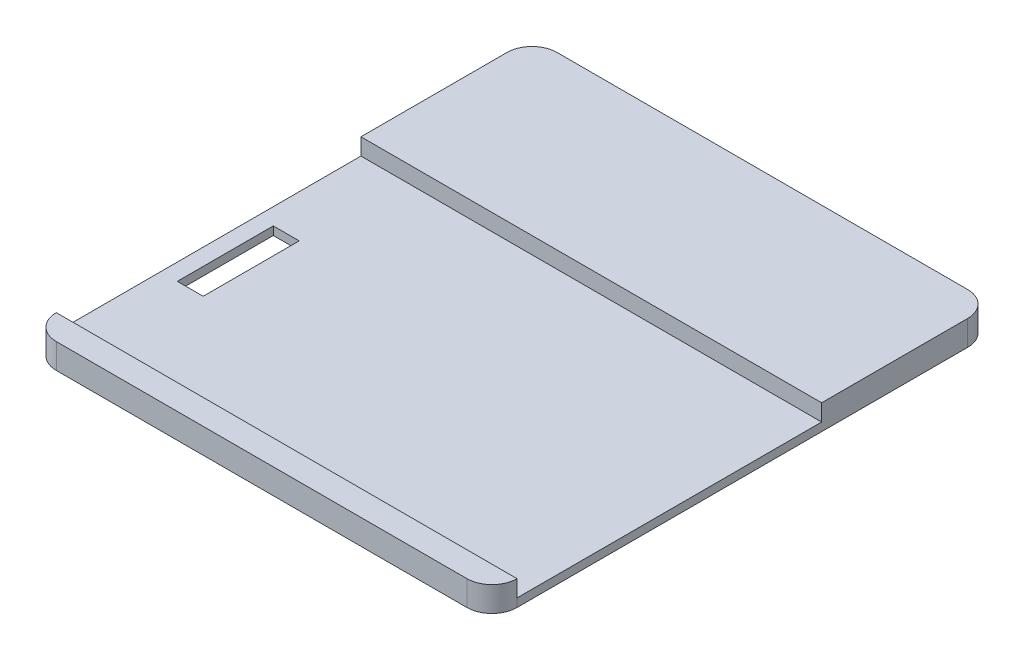
ISO-10303-21;
HEADER;
FILE_DESCRIPTION(('STEP AP214'),'2;1');
FILE_NAME('part.step','',(''),(''),'','','');
FILE_SCHEMA(('AUTOMOTIVE_DESIGN { 1 0 10303 214 1 1 1 1 }'));
ENDSEC;
DATA;
#1=APPLICATION_CONTEXT('core data for automotive mechanical design processes');
#2=APPLICATION_PROTOCOL_DEFINITION('international standard','automotive_design',2000,#1);
#3=PRODUCT_CONTEXT('',#1,'mechanical');
#4=PRODUCT('Part','Part','',(#3));
#5=PRODUCT_RELATED_PRODUCT_CATEGORY('part','',(#4));
#6=PRODUCT_DEFINITION_FORMATION('','',#4);
#7=PRODUCT_DEFINITION_CONTEXT('part definition',#1,'design');
#8=PRODUCT_DEFINITION('design','',#6,#7);
#9=PRODUCT_DEFINITION_SHAPE('','',#8);
#10=(LENGTH_UNIT() NAMED_UNIT(*) SI_UNIT(.MILLI.,.METRE.));
#11=(NAMED_UNIT(*) PLANE_ANGLE_UNIT() SI_UNIT($,.RADIAN.));
#12=(NAMED_UNIT(*) SI_UNIT($,.STERADIAN.) SOLID_ANGLE_UNIT());
#13=UNCERTAINTY_MEASURE_WITH_UNIT(LENGTH_MEASURE(1.E-05),#10,'distance_accuracy_value','');
#14=(GEOMETRIC_REPRESENTATION_CONTEXT(3) GLOBAL_UNCERTAINTY_ASSIGNED_CONTEXT((#13)) GLOBAL_UNIT_ASSIGNED_CONTEXT((#10,
#11,#12)) REPRESENTATION_CONTEXT('',''));
#15=CARTESIAN_POINT('',(0.,0.,0.));
#16=DIRECTION('',(0.,0.,1.));
#17=DIRECTION('',(1.,0.,0.));
#18=AXIS2_PLACEMENT_3D('',#15,#16,#17);
#19=CARTESIAN_POINT('',(-24.6,3.,27.));
#20=DIRECTION('',(0.,-1.,0.));
#21=DIRECTION('',(0.,0.,-1.));
#22=AXIS2_PLACEMENT_3D('',#19,#20,#21);
#23=CYLINDRICAL_SURFACE('',#22,3.);
#24=CARTESIAN_POINT('',(-24.6,0.,27.));
#25=DIRECTION('',(0.,1.,0.));
#26=DIRECTION('',(0.,0.,1.));
#27=AXIS2_PLACEMENT_3D('',#24,#25,#26);
#28=CIRCLE('',#27,3.);
#29=CARTESIAN_POINT('',(-24.6,0.,30.));
#30=VERTEX_POINT('',#29);
#31=CARTESIAN_POINT('',(-27.6,0.,27.));
#32=VERTEX_POINT('',#31);
#33=EDGE_CURVE('E236',#30,#32,#28,.F.);
#34=ORIENTED_EDGE('',*,*,#33,.F.);
#35=DIRECTION('',(0.,-1.,0.));
#36=VECTOR('',#35,1.);
#37=CARTESIAN_POINT('',(-24.6,3.,30.));
#38=LINE('',#37,#36);
#39=CARTESIAN_POINT('',(-24.6,3.,30.));
#40=VERTEX_POINT('',#39);
#41=EDGE_CURVE('E11',#40,#30,#38,.T.);
#42=ORIENTED_EDGE('',*,*,#41,.F.);
#43=CARTESIAN_POINT('',(-24.6,3.,27.));
#44=DIRECTION('',(0.,1.,0.));
#45=DIRECTION('',(0.,0.,1.));
#46=AXIS2_PLACEMENT_3D('',#43,#44,#45);
#47=CIRCLE('',#46,3.);
#48=CARTESIAN_POINT('',(-27.6,3.,27.));
#49=VERTEX_POINT('',#48);
#50=EDGE_CURVE('E244',#40,#49,#47,.F.);
#51=ORIENTED_EDGE('',*,*,#50,.T.);
#52=DIRECTION('',(0.,-1.,0.));
#53=VECTOR('',#52,1.);
#54=CARTESIAN_POINT('',(-27.6,3.,27.));
#55=LINE('',#54,#53);
#56=CARTESIAN_POINT('',(-27.6,1.,27.));
#57=VERTEX_POINT('',#56);
#58=EDGE_CURVE('E54',#49,#57,#55,.T.);
#59=ORIENTED_EDGE('',*,*,#58,.T.);
#60=DIRECTION('',(0.,-1.,0.));
#61=VECTOR('',#60,1.);
#62=CARTESIAN_POINT('',(-27.6,1.,27.));
#63=LINE('',#62,#61);
#64=EDGE_CURVE('E75',#57,#32,#63,.T.);
#65=ORIENTED_EDGE('',*,*,#64,.T.);
#66=EDGE_LOOP('',(#34,#42,#51,#59,#65));
#67=FACE_BOUND('',#66,.T.);
#68=ADVANCED_FACE('F35',(#67),#23,.T.);
#69=CARTESIAN_POINT('',(0.,3.,30.));
#70=DIRECTION('',(0.,0.,-1.));
#71=DIRECTION('',(-1.,0.,0.));
#72=AXIS2_PLACEMENT_3D('',#69,#70,#71);
#73=PLANE('',#72);
#74=DIRECTION('',(1.,0.,0.));
#75=VECTOR('',#74,1.);
#76=CARTESIAN_POINT('',(0.,0.,30.));
#77=LINE('',#76,#75);
#78=CARTESIAN_POINT('',(24.6,0.,30.));
#79=VERTEX_POINT('',#78);
#80=EDGE_CURVE('E255',#30,#79,#77,.T.);
#81=ORIENTED_EDGE('',*,*,#80,.T.);
#82=DIRECTION('',(0.,-1.,0.));
#83=VECTOR('',#82,1.);
#84=CARTESIAN_POINT('',(24.6,3.,30.));
#85=LINE('',#84,#83);
#86=CARTESIAN_POINT('',(24.6,3.,30.));
#87=VERTEX_POINT('',#86);
#88=EDGE_CURVE('E42',#87,#79,#85,.T.);
#89=ORIENTED_EDGE('',*,*,#88,.F.);
#90=DIRECTION('',(1.,0.,0.));
#91=VECTOR('',#90,1.);
#92=CARTESIAN_POINT('',(0.,3.,30.));
#93=LINE('',#92,#91);
#94=EDGE_CURVE('E246',#40,#87,#93,.T.);
#95=ORIENTED_EDGE('',*,*,#94,.F.);
#96=ORIENTED_EDGE('',*,*,#41,.T.);
#97=EDGE_LOOP('',(#81,#89,#95,#96));
#98=FACE_BOUND('',#97,.T.);
#99=ADVANCED_FACE('F270',(#98),#73,.F.);
#100=CARTESIAN_POINT('',(24.6,3.,27.));
#101=DIRECTION('',(0.,-1.,0.));
#102=DIRECTION('',(0.,0.,-1.));
#103=AXIS2_PLACEMENT_3D('',#100,#101,#102);
#104=CYLINDRICAL_SURFACE('',#103,3.);
#105=CARTESIAN_POINT('',(24.6,0.,27.));
#106=DIRECTION('',(0.,1.,0.));
#107=DIRECTION('',(0.,0.,1.));
#108=AXIS2_PLACEMENT_3D('',#105,#106,#107);
#109=CIRCLE('',#108,3.);
#110=CARTESIAN_POINT('',(27.6,0.,27.));
#111=VERTEX_POINT('',#110);
#112=EDGE_CURVE('E247',#111,#79,#109,.F.);
#113=ORIENTED_EDGE('',*,*,#112,.F.);
#114=DIRECTION('',(0.,-1.,0.));
#115=VECTOR('',#114,1.);
#116=CARTESIAN_POINT('',(27.6,1.,27.));
#117=LINE('',#116,#115);
#118=CARTESIAN_POINT('',(27.6,1.,27.));
#119=VERTEX_POINT('',#118);
#120=EDGE_CURVE('E231',#119,#111,#117,.T.);
#121=ORIENTED_EDGE('',*,*,#120,.F.);
#122=DIRECTION('',(0.,-1.,0.));
#123=VECTOR('',#122,1.);
#124=CARTESIAN_POINT('',(27.6,3.,27.));
#125=LINE('',#124,#123);
#126=CARTESIAN_POINT('',(27.6,3.,27.));
#127=VERTEX_POINT('',#126);
#128=EDGE_CURVE('E261',#127,#119,#125,.T.);
#129=ORIENTED_EDGE('',*,*,#128,.F.);
#130=CARTESIAN_POINT('',(24.6,3.,27.));
#131=DIRECTION('',(0.,1.,0.));
#132=DIRECTION('',(0.,0.,1.));
#133=AXIS2_PLACEMENT_3D('',#130,#131,#132);
#134=CIRCLE('',#133,3.);
#135=EDGE_CURVE('E249',#127,#87,#134,.F.);
#136=ORIENTED_EDGE('',*,*,#135,.T.);
#137=ORIENTED_EDGE('',*,*,#88,.T.);
#138=EDGE_LOOP('',(#113,#121,#129,#136,#137));
#139=FACE_BOUND('',#138,.T.);
#140=ADVANCED_FACE('F264',(#139),#104,.T.);
#141=CARTESIAN_POINT('',(0.,3.,27.));
#142=DIRECTION('',(0.,0.,-1.));
#143=DIRECTION('',(-1.,0.,0.));
#144=AXIS2_PLACEMENT_3D('',#141,#142,#143);
#145=PLANE('',#144);
#146=DIRECTION('',(1.,0.,0.));
#147=VECTOR('',#146,1.);
#148=CARTESIAN_POINT('',(0.,1.,27.));
#149=LINE('',#148,#147);
#150=EDGE_CURVE('E49',#57,#119,#149,.T.);
#151=ORIENTED_EDGE('',*,*,#150,.F.);
#152=ORIENTED_EDGE('',*,*,#58,.F.);
#153=DIRECTION('',(1.,0.,0.));
#154=VECTOR('',#153,1.);
#155=CARTESIAN_POINT('',(0.,3.,27.));
#156=LINE('',#155,#154);
#157=EDGE_CURVE('E252',#49,#127,#156,.T.);
#158=ORIENTED_EDGE('',*,*,#157,.T.);
#159=ORIENTED_EDGE('',*,*,#128,.T.);
#160=EDGE_LOOP('',(#151,#152,#158,#159));
#161=FACE_BOUND('',#160,.T.);
#162=ADVANCED_FACE('F283',(#161),#145,.T.);
#163=CARTESIAN_POINT('',(0.,3.,0.));
#164=DIRECTION('',(0.,1.,0.));
#165=DIRECTION('',(0.,0.,1.));
#166=AXIS2_PLACEMENT_3D('',#163,#164,#165);
#167=PLANE('',#166);
#168=ORIENTED_EDGE('',*,*,#50,.F.);
#169=ORIENTED_EDGE('',*,*,#94,.T.);
#170=ORIENTED_EDGE('',*,*,#135,.F.);
#171=ORIENTED_EDGE('',*,*,#157,.F.);
#172=EDGE_LOOP('',(#168,#169,#170,#171));
#173=FACE_BOUND('',#172,.T.);
#174=ADVANCED_FACE('F282',(#173),#167,.T.);
#175=CARTESIAN_POINT('',(0.,0.,0.));
#176=DIRECTION('',(0.,1.,0.));
#177=DIRECTION('',(0.,0.,1.));
#178=AXIS2_PLACEMENT_3D('',#175,#176,#177);
#179=PLANE('',#178);
#180=ORIENTED_EDGE('',*,*,#33,.T.);
#181=DIRECTION('',(0.,0.,-1.));
#182=VECTOR('',#181,1.);
#183=CARTESIAN_POINT('',(-27.6,0.,0.));
#184=LINE('',#183,#182);
#185=CARTESIAN_POINT('',(-27.6,0.,-27.));
#186=VERTEX_POINT('',#185);
#187=EDGE_CURVE('E228',#32,#186,#184,.T.);
#188=ORIENTED_EDGE('',*,*,#187,.T.);
#189=CARTESIAN_POINT('',(-24.6,0.,-27.));
#190=DIRECTION('',(0.,1.,0.));
#191=DIRECTION('',(0.,0.,1.));
#192=AXIS2_PLACEMENT_3D('',#189,#190,#191);
#193=CIRCLE('',#192,3.);
#194=CARTESIAN_POINT('',(-24.6,0.,-30.));
#195=VERTEX_POINT('',#194);
#196=EDGE_CURVE('E174',#195,#186,#193,.T.);
#197=ORIENTED_EDGE('',*,*,#196,.F.);
#198=DIRECTION('',(1.,0.,0.));
#199=VECTOR('',#198,1.);
#200=CARTESIAN_POINT('',(0.,0.,-30.));
#201=LINE('',#200,#199);
#202=CARTESIAN_POINT('',(24.6,0.,-30.));
#203=VERTEX_POINT('',#202);
#204=EDGE_CURVE('E151',#195,#203,#201,.T.);
#205=ORIENTED_EDGE('',*,*,#204,.T.);
#206=CARTESIAN_POINT('',(24.6,0.,-27.));
#207=DIRECTION('',(0.,1.,0.));
#208=DIRECTION('',(0.,0.,1.));
#209=AXIS2_PLACEMENT_3D('',#206,#207,#208);
#210=CIRCLE('',#209,3.);
#211=CARTESIAN_POINT('',(27.6,0.,-27.));
#212=VERTEX_POINT('',#211);
#213=EDGE_CURVE('E171',#212,#203,#210,.T.);
#214=ORIENTED_EDGE('',*,*,#213,.F.);
#215=DIRECTION('',(0.,0.,-1.));
#216=VECTOR('',#215,1.);
#217=CARTESIAN_POINT('',(27.6,0.,0.));
#218=LINE('',#217,#216);
#219=EDGE_CURVE('E201',#111,#212,#218,.T.);
#220=ORIENTED_EDGE('',*,*,#219,.F.);
#221=ORIENTED_EDGE('',*,*,#112,.T.);
#222=ORIENTED_EDGE('',*,*,#80,.F.);
#223=EDGE_LOOP('',(#180,#188,#197,#205,#214,#220,#221,#222));
#224=FACE_BOUND('',#223,.T.);
#225=DIRECTION('',(0.,0.,1.));
#226=VECTOR('',#225,1.);
#227=CARTESIAN_POINT('',(-25.6,0.,0.));
#228=LINE('',#227,#226);
#229=CARTESIAN_POINT('',(-25.6,0.,2.99999999999999));
#230=VERTEX_POINT('',#229);
#231=CARTESIAN_POINT('',(-25.6,0.,14.5));
#232=VERTEX_POINT('',#231);
#233=EDGE_CURVE('E155',#230,#232,#228,.T.);
#234=ORIENTED_EDGE('',*,*,#233,.T.);
#235=DIRECTION('',(-1.,0.,0.));
#236=VECTOR('',#235,1.);
#237=CARTESIAN_POINT('',(0.,0.,14.5));
#238=LINE('',#237,#236);
#239=CARTESIAN_POINT('',(-22.5,0.,14.5));
#240=VERTEX_POINT('',#239);
#241=EDGE_CURVE('E225',#240,#232,#238,.T.);
#242=ORIENTED_EDGE('',*,*,#241,.F.);
#243=DIRECTION('',(0.,0.,1.));
#244=VECTOR('',#243,1.);
#245=CARTESIAN_POINT('',(-22.5,0.,0.));
#246=LINE('',#245,#244);
#247=CARTESIAN_POINT('',(-22.5,0.,2.99999999999999));
#248=VERTEX_POINT('',#247);
#249=EDGE_CURVE('E223',#248,#240,#246,.T.);
#250=ORIENTED_EDGE('',*,*,#249,.F.);
#251=DIRECTION('',(-1.,0.,0.));
#252=VECTOR('',#251,1.);
#253=CARTESIAN_POINT('',(0.,0.,3.00000000000001));
#254=LINE('',#253,#252);
#255=EDGE_CURVE('E220',#248,#230,#254,.T.);
#256=ORIENTED_EDGE('',*,*,#255,.T.);
#257=EDGE_LOOP('',(#234,#242,#250,#256));
#258=FACE_BOUND('',#257,.T.);
#259=ADVANCED_FACE('F272',(#224,#258),#179,.F.);
#260=CARTESIAN_POINT('',(-27.6,1.,0.));
#261=DIRECTION('',(-1.,0.,0.));
#262=DIRECTION('',(0.,0.,1.));
#263=AXIS2_PLACEMENT_3D('',#260,#261,#262);
#264=PLANE('',#263);
#265=ORIENTED_EDGE('',*,*,#187,.F.);
#266=ORIENTED_EDGE('',*,*,#64,.F.);
#267=DIRECTION('',(0.,0.,-1.));
#268=VECTOR('',#267,1.);
#269=CARTESIAN_POINT('',(-27.6,1.,0.));
#270=LINE('',#269,#268);
#271=CARTESIAN_POINT('',(-27.6,1.,-9.50000000000001));
#272=VERTEX_POINT('',#271);
#273=EDGE_CURVE('E211',#57,#272,#270,.T.);
#274=ORIENTED_EDGE('',*,*,#273,.T.);
#275=DIRECTION('',(0.,-1.,0.));
#276=VECTOR('',#275,1.);
#277=CARTESIAN_POINT('',(-27.6,3.,-9.50000000000001));
#278=LINE('',#277,#276);
#279=CARTESIAN_POINT('',(-27.6,3.,-9.50000000000001));
#280=VERTEX_POINT('',#279);
#281=EDGE_CURVE('E193',#280,#272,#278,.T.);
#282=ORIENTED_EDGE('',*,*,#281,.F.);
#283=DIRECTION('',(0.,0.,-1.));
#284=VECTOR('',#283,1.);
#285=CARTESIAN_POINT('',(-27.6,3.,0.));
#286=LINE('',#285,#284);
#287=CARTESIAN_POINT('',(-27.6,3.,-27.));
#288=VERTEX_POINT('',#287);
#289=EDGE_CURVE('E165',#280,#288,#286,.T.);
#290=ORIENTED_EDGE('',*,*,#289,.T.);
#291=DIRECTION('',(0.,-1.,0.));
#292=VECTOR('',#291,1.);
#293=CARTESIAN_POINT('',(-27.6,3.,-27.));
#294=LINE('',#293,#292);
#295=EDGE_CURVE('E156',#288,#186,#294,.T.);
#296=ORIENTED_EDGE('',*,*,#295,.T.);
#297=EDGE_LOOP('',(#265,#266,#274,#282,#290,#296));
#298=FACE_BOUND('',#297,.T.);
#299=ADVANCED_FACE('F299',(#298),#264,.T.);
#300=CARTESIAN_POINT('',(-25.6,1.,0.));
#301=DIRECTION('',(1.,0.,0.));
#302=DIRECTION('',(0.,0.,-1.));
#303=AXIS2_PLACEMENT_3D('',#300,#301,#302);
#304=PLANE('',#303);
#305=ORIENTED_EDGE('',*,*,#233,.F.);
#306=DIRECTION('',(0.,-1.,0.));
#307=VECTOR('',#306,1.);
#308=CARTESIAN_POINT('',(-25.6,1.,2.99999999999999));
#309=LINE('',#308,#307);
#310=CARTESIAN_POINT('',(-25.6,1.,2.99999999999999));
#311=VERTEX_POINT('',#310);
#312=EDGE_CURVE('E234',#311,#230,#309,.T.);
#313=ORIENTED_EDGE('',*,*,#312,.F.);
#314=DIRECTION('',(0.,0.,1.));
#315=VECTOR('',#314,1.);
#316=CARTESIAN_POINT('',(-25.6,1.,0.));
#317=LINE('',#316,#315);
#318=CARTESIAN_POINT('',(-25.6,1.,14.5));
#319=VERTEX_POINT('',#318);
#320=EDGE_CURVE('E197',#311,#319,#317,.T.);
#321=ORIENTED_EDGE('',*,*,#320,.T.);
#322=DIRECTION('',(0.,-1.,0.));
#323=VECTOR('',#322,1.);
#324=CARTESIAN_POINT('',(-25.6,1.,14.5));
#325=LINE('',#324,#323);
#326=EDGE_CURVE('E217',#319,#232,#325,.T.);
#327=ORIENTED_EDGE('',*,*,#326,.T.);
#328=EDGE_LOOP('',(#305,#313,#321,#327));
#329=FACE_BOUND('',#328,.T.);
#330=ADVANCED_FACE('F330',(#329),#304,.T.);
#331=CARTESIAN_POINT('',(0.,1.,3.00000000000001));
#332=DIRECTION('',(0.,0.,1.));
#333=DIRECTION('',(1.,0.,0.));
#334=AXIS2_PLACEMENT_3D('',#331,#332,#333);
#335=PLANE('',#334);
#336=ORIENTED_EDGE('',*,*,#255,.F.);
#337=DIRECTION('',(0.,-1.,0.));
#338=VECTOR('',#337,1.);
#339=CARTESIAN_POINT('',(-22.5,1.,2.99999999999999));
#340=LINE('',#339,#338);
#341=CARTESIAN_POINT('',(-22.5,1.,2.99999999999999));
#342=VERTEX_POINT('',#341);
#343=EDGE_CURVE('E241',#342,#248,#340,.T.);
#344=ORIENTED_EDGE('',*,*,#343,.F.);
#345=DIRECTION('',(-1.,0.,0.));
#346=VECTOR('',#345,1.);
#347=CARTESIAN_POINT('',(0.,1.,3.00000000000001));
#348=LINE('',#347,#346);
#349=EDGE_CURVE('E200',#342,#311,#348,.T.);
#350=ORIENTED_EDGE('',*,*,#349,.T.);
#351=ORIENTED_EDGE('',*,*,#312,.T.);
#352=EDGE_LOOP('',(#336,#344,#350,#351));
#353=FACE_BOUND('',#352,.T.);
#354=ADVANCED_FACE('F337',(#353),#335,.T.);
#355=CARTESIAN_POINT('',(-22.5,1.,0.));
#356=DIRECTION('',(1.,0.,0.));
#357=DIRECTION('',(0.,0.,-1.));
#358=AXIS2_PLACEMENT_3D('',#355,#356,#357);
#359=PLANE('',#358);
#360=ORIENTED_EDGE('',*,*,#249,.T.);
#361=DIRECTION('',(0.,-1.,0.));
#362=VECTOR('',#361,1.);
#363=CARTESIAN_POINT('',(-22.5,1.,14.5));
#364=LINE('',#363,#362);
#365=CARTESIAN_POINT('',(-22.5,1.,14.5));
#366=VERTEX_POINT('',#365);
#367=EDGE_CURVE('E238',#366,#240,#364,.T.);
#368=ORIENTED_EDGE('',*,*,#367,.F.);
#369=DIRECTION('',(0.,0.,1.));
#370=VECTOR('',#369,1.);
#371=CARTESIAN_POINT('',(-22.5,1.,0.));
#372=LINE('',#371,#370);
#373=EDGE_CURVE('E204',#342,#366,#372,.T.);
#374=ORIENTED_EDGE('',*,*,#373,.F.);
#375=ORIENTED_EDGE('',*,*,#343,.T.);
#376=EDGE_LOOP('',(#360,#368,#374,#375));
#377=FACE_BOUND('',#376,.T.);
#378=ADVANCED_FACE('F333',(#377),#359,.F.);
#379=CARTESIAN_POINT('',(0.,1.,14.5));
#380=DIRECTION('',(0.,0.,1.));
#381=DIRECTION('',(1.,0.,0.));
#382=AXIS2_PLACEMENT_3D('',#379,#380,#381);
#383=PLANE('',#382);
#384=ORIENTED_EDGE('',*,*,#241,.T.);
#385=ORIENTED_EDGE('',*,*,#326,.F.);
#386=DIRECTION('',(-1.,0.,0.));
#387=VECTOR('',#386,1.);
#388=CARTESIAN_POINT('',(0.,1.,14.5));
#389=LINE('',#388,#387);
#390=EDGE_CURVE('E206',#366,#319,#389,.T.);
#391=ORIENTED_EDGE('',*,*,#390,.F.);
#392=ORIENTED_EDGE('',*,*,#367,.T.);
#393=EDGE_LOOP('',(#384,#385,#391,#392));
#394=FACE_BOUND('',#393,.T.);
#395=ADVANCED_FACE('F327',(#394),#383,.F.);
#396=CARTESIAN_POINT('',(27.6,1.,0.));
#397=DIRECTION('',(-1.,0.,0.));
#398=DIRECTION('',(0.,0.,1.));
#399=AXIS2_PLACEMENT_3D('',#396,#397,#398);
#400=PLANE('',#399);
#401=ORIENTED_EDGE('',*,*,#219,.T.);
#402=DIRECTION('',(0.,-1.,0.));
#403=VECTOR('',#402,1.);
#404=CARTESIAN_POINT('',(27.6,3.,-27.));
#405=LINE('',#404,#403);
#406=CARTESIAN_POINT('',(27.6,3.,-27.));
#407=VERTEX_POINT('',#406);
#408=EDGE_CURVE('E187',#407,#212,#405,.T.);
#409=ORIENTED_EDGE('',*,*,#408,.F.);
#410=DIRECTION('',(0.,0.,-1.));
#411=VECTOR('',#410,1.);
#412=CARTESIAN_POINT('',(27.6,3.,0.));
#413=LINE('',#412,#411);
#414=CARTESIAN_POINT('',(27.6,3.,-9.50000000000001));
#415=VERTEX_POINT('',#414);
#416=EDGE_CURVE('E180',#415,#407,#413,.T.);
#417=ORIENTED_EDGE('',*,*,#416,.F.);
#418=DIRECTION('',(0.,-1.,0.));
#419=VECTOR('',#418,1.);
#420=CARTESIAN_POINT('',(27.6,3.,-9.50000000000001));
#421=LINE('',#420,#419);
#422=CARTESIAN_POINT('',(27.6,1.,-9.50000000000001));
#423=VERTEX_POINT('',#422);
#424=EDGE_CURVE('E190',#415,#423,#421,.T.);
#425=ORIENTED_EDGE('',*,*,#424,.T.);
#426=DIRECTION('',(0.,0.,-1.));
#427=VECTOR('',#426,1.);
#428=CARTESIAN_POINT('',(27.6,1.,0.));
#429=LINE('',#428,#427);
#430=EDGE_CURVE('E215',#119,#423,#429,.T.);
#431=ORIENTED_EDGE('',*,*,#430,.F.);
#432=ORIENTED_EDGE('',*,*,#120,.T.);
#433=EDGE_LOOP('',(#401,#409,#417,#425,#431,#432));
#434=FACE_BOUND('',#433,.T.);
#435=ADVANCED_FACE('F278',(#434),#400,.F.);
#436=CARTESIAN_POINT('',(0.,1.,0.));
#437=DIRECTION('',(0.,1.,0.));
#438=DIRECTION('',(0.,0.,1.));
#439=AXIS2_PLACEMENT_3D('',#436,#437,#438);
#440=PLANE('',#439);
#441=ORIENTED_EDGE('',*,*,#320,.F.);
#442=ORIENTED_EDGE('',*,*,#349,.F.);
#443=ORIENTED_EDGE('',*,*,#373,.T.);
#444=ORIENTED_EDGE('',*,*,#390,.T.);
#445=EDGE_LOOP('',(#441,#442,#443,#444));
#446=FACE_BOUND('',#445,.T.);
#447=DIRECTION('',(1.,0.,0.));
#448=VECTOR('',#447,1.);
#449=CARTESIAN_POINT('',(0.,1.,-9.50000000000001));
#450=LINE('',#449,#448);
#451=EDGE_CURVE('E208',#272,#423,#450,.T.);
#452=ORIENTED_EDGE('',*,*,#451,.F.);
#453=ORIENTED_EDGE('',*,*,#273,.F.);
#454=ORIENTED_EDGE('',*,*,#150,.T.);
#455=ORIENTED_EDGE('',*,*,#430,.T.);
#456=EDGE_LOOP('',(#452,#453,#454,#455));
#457=FACE_BOUND('',#456,.T.);
#458=ADVANCED_FACE('F318',(#446,#457),#440,.T.);
#459=CARTESIAN_POINT('',(0.,3.,-9.50000000000001));
#460=DIRECTION('',(0.,0.,-1.));
#461=DIRECTION('',(-1.,0.,0.));
#462=AXIS2_PLACEMENT_3D('',#459,#460,#461);
#463=PLANE('',#462);
#464=ORIENTED_EDGE('',*,*,#281,.T.);
#465=ORIENTED_EDGE('',*,*,#451,.T.);
#466=ORIENTED_EDGE('',*,*,#424,.F.);
#467=DIRECTION('',(1.,0.,0.));
#468=VECTOR('',#467,1.);
#469=CARTESIAN_POINT('',(0.,3.,-9.50000000000001));
#470=LINE('',#469,#468);
#471=EDGE_CURVE('E178',#280,#415,#470,.T.);
#472=ORIENTED_EDGE('',*,*,#471,.F.);
#473=EDGE_LOOP('',(#464,#465,#466,#472));
#474=FACE_BOUND('',#473,.T.);
#475=ADVANCED_FACE('F305',(#474),#463,.F.);
#476=CARTESIAN_POINT('',(0.,3.,-30.));
#477=DIRECTION('',(0.,0.,-1.));
#478=DIRECTION('',(-1.,0.,0.));
#479=AXIS2_PLACEMENT_3D('',#476,#477,#478);
#480=PLANE('',#479);
#481=ORIENTED_EDGE('',*,*,#204,.F.);
#482=DIRECTION('',(0.,-1.,0.));
#483=VECTOR('',#482,1.);
#484=CARTESIAN_POINT('',(-24.6,3.,-30.));
#485=LINE('',#484,#483);
#486=CARTESIAN_POINT('',(-24.6,3.,-30.));
#487=VERTEX_POINT('',#486);
#488=EDGE_CURVE('E145',#487,#195,#485,.T.);
#489=ORIENTED_EDGE('',*,*,#488,.F.);
#490=DIRECTION('',(1.,0.,0.));
#491=VECTOR('',#490,1.);
#492=CARTESIAN_POINT('',(0.,3.,-30.));
#493=LINE('',#492,#491);
#494=CARTESIAN_POINT('',(24.6,3.,-30.));
#495=VERTEX_POINT('',#494);
#496=EDGE_CURVE('E149',#487,#495,#493,.T.);
#497=ORIENTED_EDGE('',*,*,#496,.T.);
#498=DIRECTION('',(0.,-1.,0.));
#499=VECTOR('',#498,1.);
#500=CARTESIAN_POINT('',(24.6,3.,-30.));
#501=LINE('',#500,#499);
#502=EDGE_CURVE('E183',#495,#203,#501,.T.);
#503=ORIENTED_EDGE('',*,*,#502,.T.);
#504=EDGE_LOOP('',(#481,#489,#497,#503));
#505=FACE_BOUND('',#504,.T.);
#506=ADVANCED_FACE('F147',(#505),#480,.T.);
#507=CARTESIAN_POINT('',(-24.6,3.,-27.));
#508=DIRECTION('',(0.,-1.,0.));
#509=DIRECTION('',(0.,0.,-1.));
#510=AXIS2_PLACEMENT_3D('',#507,#508,#509);
#511=CYLINDRICAL_SURFACE('',#510,3.);
#512=ORIENTED_EDGE('',*,*,#196,.T.);
#513=ORIENTED_EDGE('',*,*,#295,.F.);
#514=CARTESIAN_POINT('',(-24.6,3.,-27.));
#515=DIRECTION('',(0.,1.,0.));
#516=DIRECTION('',(0.,0.,1.));
#517=AXIS2_PLACEMENT_3D('',#514,#515,#516);
#518=CIRCLE('',#517,3.);
#519=EDGE_CURVE('E159',#487,#288,#518,.T.);
#520=ORIENTED_EDGE('',*,*,#519,.F.);
#521=ORIENTED_EDGE('',*,*,#488,.T.);
#522=EDGE_LOOP('',(#512,#513,#520,#521));
#523=FACE_BOUND('',#522,.T.);
#524=ADVANCED_FACE('F160',(#523),#511,.T.);
#525=CARTESIAN_POINT('',(24.6,3.,-27.));
#526=DIRECTION('',(0.,-1.,0.));
#527=DIRECTION('',(0.,0.,-1.));
#528=AXIS2_PLACEMENT_3D('',#525,#526,#527);
#529=CYLINDRICAL_SURFACE('',#528,3.);
#530=ORIENTED_EDGE('',*,*,#213,.T.);
#531=ORIENTED_EDGE('',*,*,#502,.F.);
#532=CARTESIAN_POINT('',(24.6,3.,-27.));
#533=DIRECTION('',(0.,1.,0.));
#534=DIRECTION('',(0.,0.,1.));
#535=AXIS2_PLACEMENT_3D('',#532,#533,#534);
#536=CIRCLE('',#535,3.);
#537=EDGE_CURVE('E169',#407,#495,#536,.T.);
#538=ORIENTED_EDGE('',*,*,#537,.F.);
#539=ORIENTED_EDGE('',*,*,#408,.T.);
#540=EDGE_LOOP('',(#530,#531,#538,#539));
#541=FACE_BOUND('',#540,.T.);
#542=ADVANCED_FACE('F307',(#541),#529,.T.);
#543=CARTESIAN_POINT('',(0.,3.,0.));
#544=DIRECTION('',(0.,1.,0.));
#545=DIRECTION('',(0.,0.,1.));
#546=AXIS2_PLACEMENT_3D('',#543,#544,#545);
#547=PLANE('',#546);
#548=ORIENTED_EDGE('',*,*,#496,.F.);
#549=ORIENTED_EDGE('',*,*,#519,.T.);
#550=ORIENTED_EDGE('',*,*,#289,.F.);
#551=ORIENTED_EDGE('',*,*,#471,.T.);
#552=ORIENTED_EDGE('',*,*,#416,.T.);
#553=ORIENTED_EDGE('',*,*,#537,.T.);
#554=EDGE_LOOP('',(#548,#549,#550,#551,#552,#553));
#555=FACE_BOUND('',#554,.T.);
#556=ADVANCED_FACE('F167',(#555),#547,.T.);
#557=CLOSED_SHELL('',(#68,#99,#140,#162,#174,#259,#299,#330,#354,#378,#395,#435,#458,#475,#506,
#524,#542,#556));
#558=MANIFOLD_SOLID_BREP('B2',#557);
#559=ADVANCED_BREP_SHAPE_REPRESENTATION('',(#18,#558),#14);
#560=SHAPE_DEFINITION_REPRESENTATION(#9,#559);
ENDSEC;
END-ISO-10303-21;
